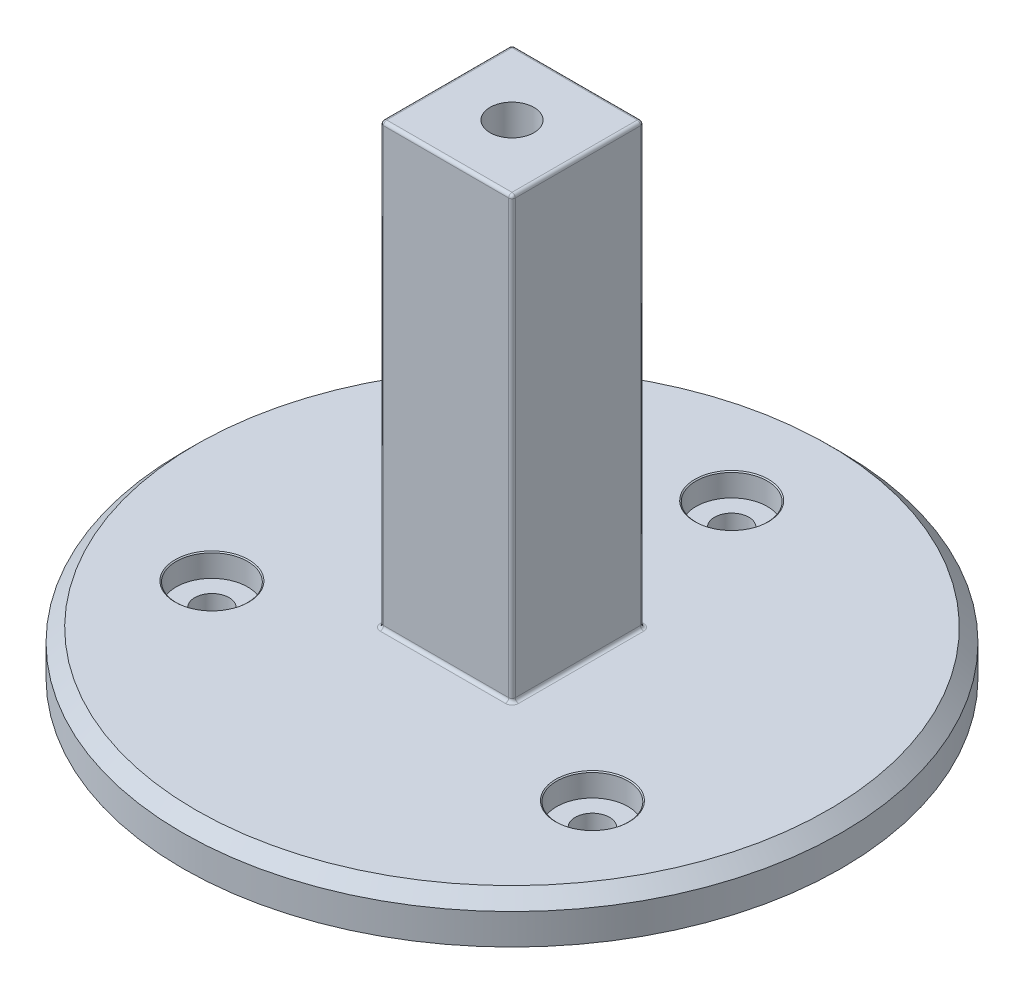
ISO-10303-21;
HEADER;
FILE_DESCRIPTION(('STEP AP214'),'2;1');
FILE_NAME('part.step','',(''),(''),'','','');
FILE_SCHEMA(('AUTOMOTIVE_DESIGN { 1 0 10303 214 1 1 1 1 }'));
ENDSEC;
DATA;
#1=APPLICATION_CONTEXT('core data for automotive mechanical design processes');
#2=APPLICATION_PROTOCOL_DEFINITION('international standard','automotive_design',2000,#1);
#3=PRODUCT_CONTEXT('',#1,'mechanical');
#4=PRODUCT('Part','Part','',(#3));
#5=PRODUCT_RELATED_PRODUCT_CATEGORY('part','',(#4));
#6=PRODUCT_DEFINITION_FORMATION('','',#4);
#7=PRODUCT_DEFINITION_CONTEXT('part definition',#1,'design');
#8=PRODUCT_DEFINITION('design','',#6,#7);
#9=PRODUCT_DEFINITION_SHAPE('','',#8);
#10=(LENGTH_UNIT() NAMED_UNIT(*) SI_UNIT(.MILLI.,.METRE.));
#11=(NAMED_UNIT(*) PLANE_ANGLE_UNIT() SI_UNIT($,.RADIAN.));
#12=(NAMED_UNIT(*) SI_UNIT($,.STERADIAN.) SOLID_ANGLE_UNIT());
#13=UNCERTAINTY_MEASURE_WITH_UNIT(LENGTH_MEASURE(1.E-05),#10,'distance_accuracy_value','');
#14=(GEOMETRIC_REPRESENTATION_CONTEXT(3) GLOBAL_UNCERTAINTY_ASSIGNED_CONTEXT((#13)) GLOBAL_UNIT_ASSIGNED_CONTEXT((#10,
#11,#12)) REPRESENTATION_CONTEXT('',''));
#15=CARTESIAN_POINT('',(0.,0.,0.));
#16=DIRECTION('',(0.,0.,1.));
#17=DIRECTION('',(1.,0.,0.));
#18=AXIS2_PLACEMENT_3D('',#15,#16,#17);
#19=CARTESIAN_POINT('',(0.,25.4,0.));
#20=DIRECTION('',(0.,1.,0.));
#21=DIRECTION('',(0.,0.,1.));
#22=AXIS2_PLACEMENT_3D('',#19,#20,#21);
#23=PLANE('',#22);
#24=CARTESIAN_POINT('',(0.,25.4,0.));
#25=DIRECTION('',(0.,1.,0.));
#26=DIRECTION('',(0.,0.,1.));
#27=AXIS2_PLACEMENT_3D('',#24,#25,#26);
#28=CIRCLE('',#27,182.88);
#29=CARTESIAN_POINT('',(0.,25.4,182.88));
#30=VERTEX_POINT('',#29);
#31=EDGE_CURVE('E340',#30,#30,#28,.T.);
#32=ORIENTED_EDGE('',*,*,#31,.T.);
#33=EDGE_LOOP('',(#32));
#34=FACE_BOUND('',#33,.T.);
#35=CARTESIAN_POINT('',(0.,25.4,-127.));
#36=DIRECTION('',(0.,1.,0.));
#37=DIRECTION('',(0.,0.,1.));
#38=AXIS2_PLACEMENT_3D('',#35,#36,#37);
#39=CIRCLE('',#38,21.2725);
#40=CARTESIAN_POINT('',(0.,25.4,-105.7275));
#41=VERTEX_POINT('',#40);
#42=EDGE_CURVE('E322',#41,#41,#39,.T.);
#43=ORIENTED_EDGE('',*,*,#42,.F.);
#44=EDGE_LOOP('',(#43));
#45=FACE_BOUND('',#44,.T.);
#46=CARTESIAN_POINT('',(-109.985226280623,25.4,63.5000000000005));
#47=DIRECTION('',(0.,1.,0.));
#48=DIRECTION('',(0.,0.,1.));
#49=AXIS2_PLACEMENT_3D('',#46,#47,#48);
#50=CIRCLE('',#49,21.2725);
#51=CARTESIAN_POINT('',(-109.985226280623,25.4,84.7725000000005));
#52=VERTEX_POINT('',#51);
#53=EDGE_CURVE('E307',#52,#52,#50,.T.);
#54=ORIENTED_EDGE('',*,*,#53,.F.);
#55=EDGE_LOOP('',(#54));
#56=FACE_BOUND('',#55,.T.);
#57=CARTESIAN_POINT('',(109.985226280624,25.4,63.499999999999));
#58=DIRECTION('',(0.,1.,0.));
#59=DIRECTION('',(0.,0.,1.));
#60=AXIS2_PLACEMENT_3D('',#57,#58,#59);
#61=CIRCLE('',#60,21.2725);
#62=CARTESIAN_POINT('',(109.985226280624,25.4,84.772499999999));
#63=VERTEX_POINT('',#62);
#64=EDGE_CURVE('E290',#63,#63,#61,.T.);
#65=ORIENTED_EDGE('',*,*,#64,.F.);
#66=EDGE_LOOP('',(#65));
#67=FACE_BOUND('',#66,.T.);
#68=CARTESIAN_POINT('',(-36.195,25.4,-36.195));
#69=DIRECTION('',(0.,1.,0.));
#70=DIRECTION('',(0.,0.,1.));
#71=AXIS2_PLACEMENT_3D('',#68,#69,#70);
#72=CIRCLE('',#71,3.81);
#73=CARTESIAN_POINT('',(-36.195,25.4,-40.005));
#74=VERTEX_POINT('',#73);
#75=CARTESIAN_POINT('',(-40.005,25.4,-36.195));
#76=VERTEX_POINT('',#75);
#77=EDGE_CURVE('E11',#74,#76,#72,.T.);
#78=ORIENTED_EDGE('',*,*,#77,.F.);
#79=DIRECTION('',(-1.,0.,0.));
#80=VECTOR('',#79,1.);
#81=CARTESIAN_POINT('',(0.,25.4,-40.005));
#82=LINE('',#81,#80);
#83=CARTESIAN_POINT('',(36.195,25.4,-40.005));
#84=VERTEX_POINT('',#83);
#85=EDGE_CURVE('E45',#74,#84,#82,.F.);
#86=ORIENTED_EDGE('',*,*,#85,.T.);
#87=CARTESIAN_POINT('',(36.195,25.4,-36.195));
#88=DIRECTION('',(0.,1.,0.));
#89=DIRECTION('',(0.,0.,1.));
#90=AXIS2_PLACEMENT_3D('',#87,#88,#89);
#91=CIRCLE('',#90,3.81);
#92=CARTESIAN_POINT('',(40.005,25.4,-36.195));
#93=VERTEX_POINT('',#92);
#94=EDGE_CURVE('E59',#93,#84,#91,.T.);
#95=ORIENTED_EDGE('',*,*,#94,.F.);
#96=DIRECTION('',(0.,0.,-1.));
#97=VECTOR('',#96,1.);
#98=CARTESIAN_POINT('',(40.005,25.4,0.));
#99=LINE('',#98,#97);
#100=CARTESIAN_POINT('',(40.005,25.4,36.195));
#101=VERTEX_POINT('',#100);
#102=EDGE_CURVE('E219',#93,#101,#99,.F.);
#103=ORIENTED_EDGE('',*,*,#102,.T.);
#104=CARTESIAN_POINT('',(36.195,25.4,36.195));
#105=DIRECTION('',(0.,1.,0.));
#106=DIRECTION('',(0.,0.,1.));
#107=AXIS2_PLACEMENT_3D('',#104,#105,#106);
#108=CIRCLE('',#107,3.81);
#109=CARTESIAN_POINT('',(36.195,25.4,40.005));
#110=VERTEX_POINT('',#109);
#111=EDGE_CURVE('E156',#110,#101,#108,.T.);
#112=ORIENTED_EDGE('',*,*,#111,.F.);
#113=DIRECTION('',(1.,0.,0.));
#114=VECTOR('',#113,1.);
#115=CARTESIAN_POINT('',(0.,25.4,40.005));
#116=LINE('',#115,#114);
#117=CARTESIAN_POINT('',(-36.195,25.4,40.005));
#118=VERTEX_POINT('',#117);
#119=EDGE_CURVE('E216',#110,#118,#116,.F.);
#120=ORIENTED_EDGE('',*,*,#119,.T.);
#121=CARTESIAN_POINT('',(-36.195,25.4,36.195));
#122=DIRECTION('',(0.,1.,0.));
#123=DIRECTION('',(0.,0.,1.));
#124=AXIS2_PLACEMENT_3D('',#121,#122,#123);
#125=CIRCLE('',#124,3.81);
#126=CARTESIAN_POINT('',(-40.005,25.4,36.195));
#127=VERTEX_POINT('',#126);
#128=EDGE_CURVE('E213',#127,#118,#125,.T.);
#129=ORIENTED_EDGE('',*,*,#128,.F.);
#130=DIRECTION('',(0.,0.,1.));
#131=VECTOR('',#130,1.);
#132=CARTESIAN_POINT('',(-40.005,25.4,0.));
#133=LINE('',#132,#131);
#134=EDGE_CURVE('E221',#127,#76,#133,.F.);
#135=ORIENTED_EDGE('',*,*,#134,.T.);
#136=EDGE_LOOP('',(#78,#86,#95,#103,#112,#120,#129,#135));
#137=FACE_BOUND('',#136,.T.);
#138=ADVANCED_FACE('F36',(#34,#45,#56,#67,#137),#23,.T.);
#139=CARTESIAN_POINT('',(0.,25.4,0.));
#140=DIRECTION('',(0.,-1.,0.));
#141=DIRECTION('',(0.,0.,-1.));
#142=AXIS2_PLACEMENT_3D('',#139,#140,#141);
#143=CYLINDRICAL_SURFACE('',#142,190.5);
#144=CARTESIAN_POINT('',(0.,17.7800000000001,0.));
#145=DIRECTION('',(0.,1.,0.));
#146=DIRECTION('',(0.,0.,1.));
#147=AXIS2_PLACEMENT_3D('',#144,#145,#146);
#148=CIRCLE('',#147,190.5);
#149=CARTESIAN_POINT('',(0.,17.7800000000001,190.5));
#150=VERTEX_POINT('',#149);
#151=EDGE_CURVE('E169',#150,#150,#148,.F.);
#152=ORIENTED_EDGE('',*,*,#151,.T.);
#153=EDGE_LOOP('',(#152));
#154=FACE_BOUND('',#153,.T.);
#155=CARTESIAN_POINT('',(0.,0.,0.));
#156=DIRECTION('',(0.,1.,0.));
#157=DIRECTION('',(0.,0.,1.));
#158=AXIS2_PLACEMENT_3D('',#155,#156,#157);
#159=CIRCLE('',#158,190.5);
#160=CARTESIAN_POINT('',(0.,0.,190.5));
#161=VERTEX_POINT('',#160);
#162=EDGE_CURVE('E337',#161,#161,#159,.T.);
#163=ORIENTED_EDGE('',*,*,#162,.T.);
#164=EDGE_LOOP('',(#163));
#165=FACE_BOUND('',#164,.T.);
#166=ADVANCED_FACE('F399',(#154,#165),#143,.T.);
#167=CARTESIAN_POINT('',(0.,0.,0.));
#168=DIRECTION('',(0.,1.,0.));
#169=DIRECTION('',(0.,0.,1.));
#170=AXIS2_PLACEMENT_3D('',#167,#168,#169);
#171=PLANE('',#170);
#172=CARTESIAN_POINT('',(109.985226280624,0.,63.499999999999));
#173=DIRECTION('',(0.,1.,0.));
#174=DIRECTION('',(0.,0.,1.));
#175=AXIS2_PLACEMENT_3D('',#172,#173,#174);
#176=CIRCLE('',#175,9.92124);
#177=CARTESIAN_POINT('',(109.985226280624,0.,73.421239999999));
#178=VERTEX_POINT('',#177);
#179=EDGE_CURVE('E304',#178,#178,#176,.T.);
#180=ORIENTED_EDGE('',*,*,#179,.T.);
#181=EDGE_LOOP('',(#180));
#182=FACE_BOUND('',#181,.T.);
#183=CARTESIAN_POINT('',(-109.985226280623,0.,63.5000000000005));
#184=DIRECTION('',(0.,1.,0.));
#185=DIRECTION('',(0.,0.,1.));
#186=AXIS2_PLACEMENT_3D('',#183,#184,#185);
#187=CIRCLE('',#186,9.92124);
#188=CARTESIAN_POINT('',(-109.985226280623,0.,73.4212400000005));
#189=VERTEX_POINT('',#188);
#190=EDGE_CURVE('E319',#189,#189,#187,.T.);
#191=ORIENTED_EDGE('',*,*,#190,.T.);
#192=EDGE_LOOP('',(#191));
#193=FACE_BOUND('',#192,.T.);
#194=CARTESIAN_POINT('',(0.,0.,-127.));
#195=DIRECTION('',(0.,1.,0.));
#196=DIRECTION('',(0.,0.,1.));
#197=AXIS2_PLACEMENT_3D('',#194,#195,#196);
#198=CIRCLE('',#197,9.92124);
#199=CARTESIAN_POINT('',(0.,0.,-117.07876));
#200=VERTEX_POINT('',#199);
#201=EDGE_CURVE('E334',#200,#200,#198,.T.);
#202=ORIENTED_EDGE('',*,*,#201,.T.);
#203=EDGE_LOOP('',(#202));
#204=FACE_BOUND('',#203,.T.);
#205=ORIENTED_EDGE('',*,*,#162,.F.);
#206=EDGE_LOOP('',(#205));
#207=FACE_BOUND('',#206,.T.);
#208=ADVANCED_FACE('F405',(#182,#193,#204,#207),#171,.F.);
#209=CARTESIAN_POINT('',(0.,25.4,0.));
#210=DIRECTION('',(0.,-1.,0.));
#211=DIRECTION('',(0.,0.,-1.));
#212=AXIS2_PLACEMENT_3D('',#209,#210,#211);
#213=CONICAL_SURFACE('',#212,182.88,0.785398163397454);
#214=ORIENTED_EDGE('',*,*,#151,.F.);
#215=EDGE_LOOP('',(#214));
#216=FACE_BOUND('',#215,.T.);
#217=ORIENTED_EDGE('',*,*,#31,.F.);
#218=EDGE_LOOP('',(#217));
#219=FACE_BOUND('',#218,.T.);
#220=ADVANCED_FACE('F413',(#216,#219),#213,.T.);
#221=CARTESIAN_POINT('',(38.1,279.4,38.1));
#222=DIRECTION('',(-1.,0.,0.));
#223=DIRECTION('',(0.,0.,1.));
#224=AXIS2_PLACEMENT_3D('',#221,#222,#223);
#225=PLANE('',#224);
#226=DIRECTION('',(0.,0.,-1.));
#227=VECTOR('',#226,1.);
#228=CARTESIAN_POINT('',(38.1,277.495,38.1));
#229=LINE('',#228,#227);
#230=CARTESIAN_POINT('',(38.1,277.495,-36.195));
#231=VERTEX_POINT('',#230);
#232=CARTESIAN_POINT('',(38.1,277.495,36.195));
#233=VERTEX_POINT('',#232);
#234=EDGE_CURVE('E173',#231,#233,#229,.F.);
#235=ORIENTED_EDGE('',*,*,#234,.T.);
#236=DIRECTION('',(0.,-1.,0.));
#237=VECTOR('',#236,1.);
#238=CARTESIAN_POINT('',(38.1,279.4,36.195));
#239=LINE('',#238,#237);
#240=CARTESIAN_POINT('',(38.1,27.305,36.195));
#241=VERTEX_POINT('',#240);
#242=EDGE_CURVE('E144',#233,#241,#239,.T.);
#243=ORIENTED_EDGE('',*,*,#242,.T.);
#244=DIRECTION('',(0.,0.,-1.));
#245=VECTOR('',#244,1.);
#246=CARTESIAN_POINT('',(38.1,27.305,38.1));
#247=LINE('',#246,#245);
#248=CARTESIAN_POINT('',(38.1,27.305,-36.195));
#249=VERTEX_POINT('',#248);
#250=EDGE_CURVE('E163',#241,#249,#247,.T.);
#251=ORIENTED_EDGE('',*,*,#250,.T.);
#252=DIRECTION('',(0.,-1.,0.));
#253=VECTOR('',#252,1.);
#254=CARTESIAN_POINT('',(38.1,279.4,-36.195));
#255=LINE('',#254,#253);
#256=EDGE_CURVE('E168',#249,#231,#255,.F.);
#257=ORIENTED_EDGE('',*,*,#256,.T.);
#258=EDGE_LOOP('',(#235,#243,#251,#257));
#259=FACE_BOUND('',#258,.T.);
#260=ADVANCED_FACE('F171',(#259),#225,.F.);
#261=CARTESIAN_POINT('',(-38.1,279.4,-38.1));
#262=DIRECTION('',(0.,0.,1.));
#263=DIRECTION('',(1.,0.,0.));
#264=AXIS2_PLACEMENT_3D('',#261,#262,#263);
#265=PLANE('',#264);
#266=DIRECTION('',(0.,-1.,0.));
#267=VECTOR('',#266,1.);
#268=CARTESIAN_POINT('',(-36.195,279.4,-38.1));
#269=LINE('',#268,#267);
#270=CARTESIAN_POINT('',(-36.195,27.305,-38.1));
#271=VERTEX_POINT('',#270);
#272=CARTESIAN_POINT('',(-36.195,277.495,-38.1));
#273=VERTEX_POINT('',#272);
#274=EDGE_CURVE('E206',#271,#273,#269,.F.);
#275=ORIENTED_EDGE('',*,*,#274,.T.);
#276=DIRECTION('',(-1.,0.,0.));
#277=VECTOR('',#276,1.);
#278=CARTESIAN_POINT('',(-38.1,277.495,-38.1));
#279=LINE('',#278,#277);
#280=CARTESIAN_POINT('',(36.195,277.495,-38.1));
#281=VERTEX_POINT('',#280);
#282=EDGE_CURVE('E210',#273,#281,#279,.F.);
#283=ORIENTED_EDGE('',*,*,#282,.T.);
#284=DIRECTION('',(0.,-1.,0.));
#285=VECTOR('',#284,1.);
#286=CARTESIAN_POINT('',(36.195,279.4,-38.1));
#287=LINE('',#286,#285);
#288=CARTESIAN_POINT('',(36.195,27.305,-38.1));
#289=VERTEX_POINT('',#288);
#290=EDGE_CURVE('E208',#281,#289,#287,.T.);
#291=ORIENTED_EDGE('',*,*,#290,.T.);
#292=DIRECTION('',(-1.,0.,0.));
#293=VECTOR('',#292,1.);
#294=CARTESIAN_POINT('',(-38.1,27.305,-38.1));
#295=LINE('',#294,#293);
#296=EDGE_CURVE('E204',#289,#271,#295,.T.);
#297=ORIENTED_EDGE('',*,*,#296,.T.);
#298=EDGE_LOOP('',(#275,#283,#291,#297));
#299=FACE_BOUND('',#298,.T.);
#300=ADVANCED_FACE('F722',(#299),#265,.F.);
#301=CARTESIAN_POINT('',(-38.1,279.4,38.1));
#302=DIRECTION('',(1.,0.,0.));
#303=DIRECTION('',(0.,0.,-1.));
#304=AXIS2_PLACEMENT_3D('',#301,#302,#303);
#305=PLANE('',#304);
#306=DIRECTION('',(0.,0.,1.));
#307=VECTOR('',#306,1.);
#308=CARTESIAN_POINT('',(-38.1,27.305,38.1));
#309=LINE('',#308,#307);
#310=CARTESIAN_POINT('',(-38.1,27.305,-36.195));
#311=VERTEX_POINT('',#310);
#312=CARTESIAN_POINT('',(-38.1,27.305,36.195));
#313=VERTEX_POINT('',#312);
#314=EDGE_CURVE('E186',#311,#313,#309,.T.);
#315=ORIENTED_EDGE('',*,*,#314,.T.);
#316=DIRECTION('',(0.,-1.,0.));
#317=VECTOR('',#316,1.);
#318=CARTESIAN_POINT('',(-38.1,279.4,36.195));
#319=LINE('',#318,#317);
#320=CARTESIAN_POINT('',(-38.1,277.495,36.195));
#321=VERTEX_POINT('',#320);
#322=EDGE_CURVE('E192',#313,#321,#319,.F.);
#323=ORIENTED_EDGE('',*,*,#322,.T.);
#324=DIRECTION('',(0.,0.,1.));
#325=VECTOR('',#324,1.);
#326=CARTESIAN_POINT('',(-38.1,277.495,38.1));
#327=LINE('',#326,#325);
#328=CARTESIAN_POINT('',(-38.1,277.495,-36.195));
#329=VERTEX_POINT('',#328);
#330=EDGE_CURVE('E190',#321,#329,#327,.F.);
#331=ORIENTED_EDGE('',*,*,#330,.T.);
#332=DIRECTION('',(0.,-1.,0.));
#333=VECTOR('',#332,1.);
#334=CARTESIAN_POINT('',(-38.1,279.4,-36.195));
#335=LINE('',#334,#333);
#336=EDGE_CURVE('E188',#329,#311,#335,.T.);
#337=ORIENTED_EDGE('',*,*,#336,.T.);
#338=EDGE_LOOP('',(#315,#323,#331,#337));
#339=FACE_BOUND('',#338,.T.);
#340=ADVANCED_FACE('F714',(#339),#305,.F.);
#341=CARTESIAN_POINT('',(-38.1,279.4,38.1));
#342=DIRECTION('',(0.,0.,-1.));
#343=DIRECTION('',(-1.,0.,0.));
#344=AXIS2_PLACEMENT_3D('',#341,#342,#343);
#345=PLANE('',#344);
#346=DIRECTION('',(0.,-1.,0.));
#347=VECTOR('',#346,1.);
#348=CARTESIAN_POINT('',(36.195,279.4,38.1));
#349=LINE('',#348,#347);
#350=CARTESIAN_POINT('',(36.195,27.305,38.1));
#351=VERTEX_POINT('',#350);
#352=CARTESIAN_POINT('',(36.195,277.495,38.1));
#353=VERTEX_POINT('',#352);
#354=EDGE_CURVE('E146',#351,#353,#349,.F.);
#355=ORIENTED_EDGE('',*,*,#354,.T.);
#356=DIRECTION('',(1.,0.,0.));
#357=VECTOR('',#356,1.);
#358=CARTESIAN_POINT('',(-38.1,277.495,38.1));
#359=LINE('',#358,#357);
#360=CARTESIAN_POINT('',(-36.195,277.495,38.1));
#361=VERTEX_POINT('',#360);
#362=EDGE_CURVE('E184',#353,#361,#359,.F.);
#363=ORIENTED_EDGE('',*,*,#362,.T.);
#364=DIRECTION('',(0.,-1.,0.));
#365=VECTOR('',#364,1.);
#366=CARTESIAN_POINT('',(-36.195,279.4,38.1));
#367=LINE('',#366,#365);
#368=CARTESIAN_POINT('',(-36.195,27.305,38.1));
#369=VERTEX_POINT('',#368);
#370=EDGE_CURVE('E177',#361,#369,#367,.T.);
#371=ORIENTED_EDGE('',*,*,#370,.T.);
#372=DIRECTION('',(1.,0.,0.));
#373=VECTOR('',#372,1.);
#374=CARTESIAN_POINT('',(-38.1,27.305,38.1));
#375=LINE('',#374,#373);
#376=EDGE_CURVE('E175',#369,#351,#375,.T.);
#377=ORIENTED_EDGE('',*,*,#376,.T.);
#378=EDGE_LOOP('',(#355,#363,#371,#377));
#379=FACE_BOUND('',#378,.T.);
#380=ADVANCED_FACE('F368',(#379),#345,.F.);
#381=CARTESIAN_POINT('',(0.,279.4,0.));
#382=DIRECTION('',(0.,-1.,0.));
#383=DIRECTION('',(0.,0.,-1.));
#384=AXIS2_PLACEMENT_3D('',#381,#382,#383);
#385=PLANE('',#384);
#386=DIRECTION('',(1.,0.,0.));
#387=VECTOR('',#386,1.);
#388=CARTESIAN_POINT('',(0.,279.4,36.195));
#389=LINE('',#388,#387);
#390=CARTESIAN_POINT('',(-36.195,279.4,36.195));
#391=VERTEX_POINT('',#390);
#392=CARTESIAN_POINT('',(36.195,279.4,36.195));
#393=VERTEX_POINT('',#392);
#394=EDGE_CURVE('E199',#391,#393,#389,.T.);
#395=ORIENTED_EDGE('',*,*,#394,.T.);
#396=DIRECTION('',(0.,0.,-1.));
#397=VECTOR('',#396,1.);
#398=CARTESIAN_POINT('',(36.195,279.4,0.));
#399=LINE('',#398,#397);
#400=CARTESIAN_POINT('',(36.195,279.4,-36.195));
#401=VERTEX_POINT('',#400);
#402=EDGE_CURVE('E201',#393,#401,#399,.T.);
#403=ORIENTED_EDGE('',*,*,#402,.T.);
#404=DIRECTION('',(-1.,0.,0.));
#405=VECTOR('',#404,1.);
#406=CARTESIAN_POINT('',(0.,279.4,-36.195));
#407=LINE('',#406,#405);
#408=CARTESIAN_POINT('',(-36.195,279.4,-36.195));
#409=VERTEX_POINT('',#408);
#410=EDGE_CURVE('E195',#401,#409,#407,.T.);
#411=ORIENTED_EDGE('',*,*,#410,.T.);
#412=DIRECTION('',(0.,0.,1.));
#413=VECTOR('',#412,1.);
#414=CARTESIAN_POINT('',(-36.195,279.4,0.));
#415=LINE('',#414,#413);
#416=EDGE_CURVE('E197',#409,#391,#415,.T.);
#417=ORIENTED_EDGE('',*,*,#416,.T.);
#418=EDGE_LOOP('',(#395,#403,#411,#417));
#419=FACE_BOUND('',#418,.T.);
#420=CARTESIAN_POINT('',(0.,279.4,0.));
#421=DIRECTION('',(0.,1.,0.));
#422=DIRECTION('',(0.,0.,1.));
#423=AXIS2_PLACEMENT_3D('',#420,#421,#422);
#424=CIRCLE('',#423,12.7);
#425=CARTESIAN_POINT('',(0.,279.4,12.7));
#426=VERTEX_POINT('',#425);
#427=EDGE_CURVE('E279',#426,#426,#424,.T.);
#428=ORIENTED_EDGE('',*,*,#427,.F.);
#429=EDGE_LOOP('',(#428));
#430=FACE_BOUND('',#429,.T.);
#431=ADVANCED_FACE('F697',(#419,#430),#385,.F.);
#432=CARTESIAN_POINT('',(0.,25.4,-127.));
#433=DIRECTION('',(0.,1.,0.));
#434=DIRECTION('',(0.,0.,1.));
#435=AXIS2_PLACEMENT_3D('',#432,#433,#434);
#436=CYLINDRICAL_SURFACE('',#435,9.92124);
#437=ORIENTED_EDGE('',*,*,#201,.F.);
#438=EDGE_LOOP('',(#437));
#439=FACE_BOUND('',#438,.T.);
#440=CARTESIAN_POINT('',(0.,12.0904,-127.));
#441=DIRECTION('',(0.,1.,0.));
#442=DIRECTION('',(0.,0.,1.));
#443=AXIS2_PLACEMENT_3D('',#440,#441,#442);
#444=CIRCLE('',#443,9.92124);
#445=CARTESIAN_POINT('',(0.,12.0904,-117.07876));
#446=VERTEX_POINT('',#445);
#447=EDGE_CURVE('E331',#446,#446,#444,.T.);
#448=ORIENTED_EDGE('',*,*,#447,.T.);
#449=EDGE_LOOP('',(#448));
#450=FACE_BOUND('',#449,.T.);
#451=ADVANCED_FACE('F688',(#439,#450),#436,.F.);
#452=CARTESIAN_POINT('',(20.6375,12.0904,-127.));
#453=DIRECTION('',(0.,-1.,0.));
#454=DIRECTION('',(0.,0.,-1.));
#455=AXIS2_PLACEMENT_3D('',#452,#453,#454);
#456=PLANE('',#455);
#457=ORIENTED_EDGE('',*,*,#447,.F.);
#458=EDGE_LOOP('',(#457));
#459=FACE_BOUND('',#458,.T.);
#460=CARTESIAN_POINT('',(0.,12.0904,-127.));
#461=DIRECTION('',(0.,1.,0.));
#462=DIRECTION('',(0.,0.,1.));
#463=AXIS2_PLACEMENT_3D('',#460,#461,#462);
#464=CIRCLE('',#463,20.6375);
#465=CARTESIAN_POINT('',(0.,12.0904,-106.3625));
#466=VERTEX_POINT('',#465);
#467=EDGE_CURVE('E328',#466,#466,#464,.T.);
#468=ORIENTED_EDGE('',*,*,#467,.T.);
#469=EDGE_LOOP('',(#468));
#470=FACE_BOUND('',#469,.T.);
#471=ADVANCED_FACE('F679',(#459,#470),#456,.F.);
#472=CARTESIAN_POINT('',(0.,25.4,-127.));
#473=DIRECTION('',(0.,1.,0.));
#474=DIRECTION('',(0.,0.,1.));
#475=AXIS2_PLACEMENT_3D('',#472,#473,#474);
#476=CYLINDRICAL_SURFACE('',#475,20.6375);
#477=ORIENTED_EDGE('',*,*,#467,.F.);
#478=EDGE_LOOP('',(#477));
#479=FACE_BOUND('',#478,.T.);
#480=CARTESIAN_POINT('',(0.,24.8671717342024,-127.));
#481=DIRECTION('',(0.,1.,0.));
#482=DIRECTION('',(0.,0.,1.));
#483=AXIS2_PLACEMENT_3D('',#480,#481,#482);
#484=CIRCLE('',#483,20.6375);
#485=CARTESIAN_POINT('',(0.,24.8671717342024,-106.3625));
#486=VERTEX_POINT('',#485);
#487=EDGE_CURVE('E325',#486,#486,#484,.T.);
#488=ORIENTED_EDGE('',*,*,#487,.T.);
#489=EDGE_LOOP('',(#488));
#490=FACE_BOUND('',#489,.T.);
#491=ADVANCED_FACE('F670',(#479,#490),#476,.F.);
#492=CARTESIAN_POINT('',(0.,25.4,-127.));
#493=DIRECTION('',(0.,1.,0.));
#494=DIRECTION('',(0.,0.,1.));
#495=AXIS2_PLACEMENT_3D('',#492,#493,#494);
#496=CONICAL_SURFACE('',#495,21.2725,0.872664625997164);
#497=ORIENTED_EDGE('',*,*,#487,.F.);
#498=EDGE_LOOP('',(#497));
#499=FACE_BOUND('',#498,.T.);
#500=ORIENTED_EDGE('',*,*,#42,.T.);
#501=EDGE_LOOP('',(#500));
#502=FACE_BOUND('',#501,.T.);
#503=ADVANCED_FACE('F660',(#499,#502),#496,.F.);
#504=CARTESIAN_POINT('',(-109.985226280623,25.4,63.5000000000005));
#505=DIRECTION('',(0.,1.,0.));
#506=DIRECTION('',(0.,0.,1.));
#507=AXIS2_PLACEMENT_3D('',#504,#505,#506);
#508=CYLINDRICAL_SURFACE('',#507,9.92124);
#509=ORIENTED_EDGE('',*,*,#190,.F.);
#510=EDGE_LOOP('',(#509));
#511=FACE_BOUND('',#510,.T.);
#512=CARTESIAN_POINT('',(-109.985226280623,12.0904,63.5000000000005));
#513=DIRECTION('',(0.,1.,0.));
#514=DIRECTION('',(0.,0.,1.));
#515=AXIS2_PLACEMENT_3D('',#512,#513,#514);
#516=CIRCLE('',#515,9.92124);
#517=CARTESIAN_POINT('',(-109.985226280623,12.0904,73.4212400000005));
#518=VERTEX_POINT('',#517);
#519=EDGE_CURVE('E316',#518,#518,#516,.T.);
#520=ORIENTED_EDGE('',*,*,#519,.T.);
#521=EDGE_LOOP('',(#520));
#522=FACE_BOUND('',#521,.T.);
#523=ADVANCED_FACE('F651',(#511,#522),#508,.F.);
#524=CARTESIAN_POINT('',(-89.3477262806234,12.0904,63.5000000000005));
#525=DIRECTION('',(0.,-1.,0.));
#526=DIRECTION('',(0.,0.,-1.));
#527=AXIS2_PLACEMENT_3D('',#524,#525,#526);
#528=PLANE('',#527);
#529=ORIENTED_EDGE('',*,*,#519,.F.);
#530=EDGE_LOOP('',(#529));
#531=FACE_BOUND('',#530,.T.);
#532=CARTESIAN_POINT('',(-109.985226280623,12.0904,63.5000000000005));
#533=DIRECTION('',(0.,1.,0.));
#534=DIRECTION('',(0.,0.,1.));
#535=AXIS2_PLACEMENT_3D('',#532,#533,#534);
#536=CIRCLE('',#535,20.6375);
#537=CARTESIAN_POINT('',(-109.985226280623,12.0904,84.1375000000005));
#538=VERTEX_POINT('',#537);
#539=EDGE_CURVE('E313',#538,#538,#536,.T.);
#540=ORIENTED_EDGE('',*,*,#539,.T.);
#541=EDGE_LOOP('',(#540));
#542=FACE_BOUND('',#541,.T.);
#543=ADVANCED_FACE('F642',(#531,#542),#528,.F.);
#544=CARTESIAN_POINT('',(-109.985226280623,25.4,63.5000000000005));
#545=DIRECTION('',(0.,1.,0.));
#546=DIRECTION('',(0.,0.,1.));
#547=AXIS2_PLACEMENT_3D('',#544,#545,#546);
#548=CYLINDRICAL_SURFACE('',#547,20.6375);
#549=ORIENTED_EDGE('',*,*,#539,.F.);
#550=EDGE_LOOP('',(#549));
#551=FACE_BOUND('',#550,.T.);
#552=CARTESIAN_POINT('',(-109.985226280623,24.8671717342024,63.5000000000005));
#553=DIRECTION('',(0.,1.,0.));
#554=DIRECTION('',(0.,0.,1.));
#555=AXIS2_PLACEMENT_3D('',#552,#553,#554);
#556=CIRCLE('',#555,20.6375);
#557=CARTESIAN_POINT('',(-109.985226280623,24.8671717342024,84.1375000000005));
#558=VERTEX_POINT('',#557);
#559=EDGE_CURVE('E310',#558,#558,#556,.T.);
#560=ORIENTED_EDGE('',*,*,#559,.T.);
#561=EDGE_LOOP('',(#560));
#562=FACE_BOUND('',#561,.T.);
#563=ADVANCED_FACE('F633',(#551,#562),#548,.F.);
#564=CARTESIAN_POINT('',(-109.985226280623,25.4,63.5000000000005));
#565=DIRECTION('',(0.,1.,0.));
#566=DIRECTION('',(0.,0.,1.));
#567=AXIS2_PLACEMENT_3D('',#564,#565,#566);
#568=CONICAL_SURFACE('',#567,21.2725,0.872664625997164);
#569=ORIENTED_EDGE('',*,*,#559,.F.);
#570=EDGE_LOOP('',(#569));
#571=FACE_BOUND('',#570,.T.);
#572=ORIENTED_EDGE('',*,*,#53,.T.);
#573=EDGE_LOOP('',(#572));
#574=FACE_BOUND('',#573,.T.);
#575=ADVANCED_FACE('F624',(#571,#574),#568,.F.);
#576=CARTESIAN_POINT('',(109.985226280624,25.4,63.499999999999));
#577=DIRECTION('',(0.,1.,0.));
#578=DIRECTION('',(0.,0.,1.));
#579=AXIS2_PLACEMENT_3D('',#576,#577,#578);
#580=CYLINDRICAL_SURFACE('',#579,9.92124);
#581=ORIENTED_EDGE('',*,*,#179,.F.);
#582=EDGE_LOOP('',(#581));
#583=FACE_BOUND('',#582,.T.);
#584=CARTESIAN_POINT('',(109.985226280624,12.0904,63.499999999999));
#585=DIRECTION('',(0.,1.,0.));
#586=DIRECTION('',(0.,0.,1.));
#587=AXIS2_PLACEMENT_3D('',#584,#585,#586);
#588=CIRCLE('',#587,9.92124);
#589=CARTESIAN_POINT('',(109.985226280624,12.0904,73.421239999999));
#590=VERTEX_POINT('',#589);
#591=EDGE_CURVE('E301',#590,#590,#588,.T.);
#592=ORIENTED_EDGE('',*,*,#591,.T.);
#593=EDGE_LOOP('',(#592));
#594=FACE_BOUND('',#593,.T.);
#595=ADVANCED_FACE('F615',(#583,#594),#580,.F.);
#596=CARTESIAN_POINT('',(130.622726280624,12.0904,63.499999999999));
#597=DIRECTION('',(0.,-1.,0.));
#598=DIRECTION('',(0.,0.,-1.));
#599=AXIS2_PLACEMENT_3D('',#596,#597,#598);
#600=PLANE('',#599);
#601=ORIENTED_EDGE('',*,*,#591,.F.);
#602=EDGE_LOOP('',(#601));
#603=FACE_BOUND('',#602,.T.);
#604=CARTESIAN_POINT('',(109.985226280624,12.0904,63.499999999999));
#605=DIRECTION('',(0.,1.,0.));
#606=DIRECTION('',(0.,0.,1.));
#607=AXIS2_PLACEMENT_3D('',#604,#605,#606);
#608=CIRCLE('',#607,20.6375);
#609=CARTESIAN_POINT('',(109.985226280624,12.0904,84.137499999999));
#610=VERTEX_POINT('',#609);
#611=EDGE_CURVE('E298',#610,#610,#608,.T.);
#612=ORIENTED_EDGE('',*,*,#611,.T.);
#613=EDGE_LOOP('',(#612));
#614=FACE_BOUND('',#613,.T.);
#615=ADVANCED_FACE('F606',(#603,#614),#600,.F.);
#616=CARTESIAN_POINT('',(109.985226280624,25.4,63.499999999999));
#617=DIRECTION('',(0.,1.,0.));
#618=DIRECTION('',(0.,0.,1.));
#619=AXIS2_PLACEMENT_3D('',#616,#617,#618);
#620=CYLINDRICAL_SURFACE('',#619,20.6375);
#621=ORIENTED_EDGE('',*,*,#611,.F.);
#622=EDGE_LOOP('',(#621));
#623=FACE_BOUND('',#622,.T.);
#624=CARTESIAN_POINT('',(109.985226280624,24.8671717342024,63.499999999999));
#625=DIRECTION('',(0.,1.,0.));
#626=DIRECTION('',(0.,0.,1.));
#627=AXIS2_PLACEMENT_3D('',#624,#625,#626);
#628=CIRCLE('',#627,20.6375);
#629=CARTESIAN_POINT('',(109.985226280624,24.8671717342024,84.137499999999));
#630=VERTEX_POINT('',#629);
#631=EDGE_CURVE('E295',#630,#630,#628,.T.);
#632=ORIENTED_EDGE('',*,*,#631,.T.);
#633=EDGE_LOOP('',(#632));
#634=FACE_BOUND('',#633,.T.);
#635=ADVANCED_FACE('F597',(#623,#634),#620,.F.);
#636=CARTESIAN_POINT('',(109.985226280624,25.4,63.499999999999));
#637=DIRECTION('',(0.,1.,0.));
#638=DIRECTION('',(0.,0.,1.));
#639=AXIS2_PLACEMENT_3D('',#636,#637,#638);
#640=CONICAL_SURFACE('',#639,21.2725,0.872664625997164);
#641=ORIENTED_EDGE('',*,*,#631,.F.);
#642=EDGE_LOOP('',(#641));
#643=FACE_BOUND('',#642,.T.);
#644=ORIENTED_EDGE('',*,*,#64,.T.);
#645=EDGE_LOOP('',(#644));
#646=FACE_BOUND('',#645,.T.);
#647=ADVANCED_FACE('F588',(#643,#646),#640,.F.);
#648=CARTESIAN_POINT('',(0.,25.4,0.));
#649=DIRECTION('',(0.,-1.,0.));
#650=DIRECTION('',(0.,0.,-1.));
#651=AXIS2_PLACEMENT_3D('',#648,#649,#650);
#652=PLANE('',#651);
#653=CARTESIAN_POINT('',(0.,25.4,0.));
#654=DIRECTION('',(0.,1.,0.));
#655=DIRECTION('',(0.,0.,1.));
#656=AXIS2_PLACEMENT_3D('',#653,#654,#655);
#657=CIRCLE('',#656,12.7);
#658=CARTESIAN_POINT('',(0.,25.4,12.7));
#659=VERTEX_POINT('',#658);
#660=EDGE_CURVE('E285',#659,#659,#657,.T.);
#661=ORIENTED_EDGE('',*,*,#660,.T.);
#662=EDGE_LOOP('',(#661));
#663=FACE_BOUND('',#662,.T.);
#664=ADVANCED_FACE('F579',(#663),#652,.F.);
#665=CARTESIAN_POINT('',(0.,279.4,0.));
#666=DIRECTION('',(0.,1.,0.));
#667=DIRECTION('',(0.,0.,1.));
#668=AXIS2_PLACEMENT_3D('',#665,#666,#667);
#669=CYLINDRICAL_SURFACE('',#668,12.7);
#670=ORIENTED_EDGE('',*,*,#660,.F.);
#671=EDGE_LOOP('',(#670));
#672=FACE_BOUND('',#671,.T.);
#673=ORIENTED_EDGE('',*,*,#427,.T.);
#674=EDGE_LOOP('',(#673));
#675=FACE_BOUND('',#674,.T.);
#676=ADVANCED_FACE('F565',(#672,#675),#669,.F.);
#677=CARTESIAN_POINT('',(-36.195,279.4,-36.195));
#678=DIRECTION('',(0.,-1.,0.));
#679=DIRECTION('',(0.,0.,-1.));
#680=AXIS2_PLACEMENT_3D('',#677,#678,#679);
#681=CYLINDRICAL_SURFACE('',#680,1.905);
#682=CARTESIAN_POINT('',(-36.195,277.495,-36.195));
#683=DIRECTION('',(0.,1.,0.));
#684=DIRECTION('',(0.,0.,1.));
#685=AXIS2_PLACEMENT_3D('',#682,#683,#684);
#686=CIRCLE('',#685,1.905);
#687=EDGE_CURVE('E40',#273,#329,#686,.T.);
#688=ORIENTED_EDGE('',*,*,#687,.F.);
#689=ORIENTED_EDGE('',*,*,#274,.F.);
#690=CARTESIAN_POINT('',(-36.195,27.305,-36.195));
#691=DIRECTION('',(0.,1.,0.));
#692=DIRECTION('',(0.,0.,1.));
#693=AXIS2_PLACEMENT_3D('',#690,#691,#692);
#694=CIRCLE('',#693,1.905);
#695=EDGE_CURVE('E273',#311,#271,#694,.F.);
#696=ORIENTED_EDGE('',*,*,#695,.F.);
#697=ORIENTED_EDGE('',*,*,#336,.F.);
#698=EDGE_LOOP('',(#688,#689,#696,#697));
#699=FACE_BOUND('',#698,.T.);
#700=ADVANCED_FACE('F38',(#699),#681,.T.);
#701=CARTESIAN_POINT('',(-36.195,277.495,-36.195));
#702=DIRECTION('',(0.,0.,1.));
#703=DIRECTION('',(1.,0.,0.));
#704=AXIS2_PLACEMENT_3D('',#701,#702,#703);
#705=SPHERICAL_SURFACE('',#704,1.905);
#706=CARTESIAN_POINT('',(-36.195,277.495,-36.195));
#707=DIRECTION('',(-1.,0.,0.));
#708=DIRECTION('',(0.,0.,1.));
#709=AXIS2_PLACEMENT_3D('',#706,#707,#708);
#710=CIRCLE('',#709,1.905);
#711=EDGE_CURVE('E268',#273,#409,#710,.F.);
#712=ORIENTED_EDGE('',*,*,#711,.F.);
#713=ORIENTED_EDGE('',*,*,#687,.T.);
#714=CARTESIAN_POINT('',(-36.195,277.495,-36.195));
#715=DIRECTION('',(0.,0.,-1.));
#716=DIRECTION('',(0.,1.,0.));
#717=AXIS2_PLACEMENT_3D('',#714,#715,#716);
#718=CIRCLE('',#717,1.905);
#719=EDGE_CURVE('E271',#409,#329,#718,.F.);
#720=ORIENTED_EDGE('',*,*,#719,.F.);
#721=EDGE_LOOP('',(#712,#713,#720));
#722=FACE_BOUND('',#721,.T.);
#723=ADVANCED_FACE('F551',(#722),#705,.T.);
#724=CARTESIAN_POINT('',(-36.195,27.305,-36.195));
#725=DIRECTION('',(0.,1.,0.));
#726=DIRECTION('',(0.,0.,1.));
#727=AXIS2_PLACEMENT_3D('',#724,#725,#726);
#728=TOROIDAL_SURFACE('',#727,3.81,1.905);
#729=CARTESIAN_POINT('',(-40.005,27.305,-36.195));
#730=DIRECTION('',(0.,0.,1.));
#731=DIRECTION('',(1.,0.,0.));
#732=AXIS2_PLACEMENT_3D('',#729,#730,#731);
#733=CIRCLE('',#732,1.905);
#734=EDGE_CURVE('E262',#311,#76,#733,.F.);
#735=ORIENTED_EDGE('',*,*,#734,.F.);
#736=ORIENTED_EDGE('',*,*,#695,.T.);
#737=CARTESIAN_POINT('',(-36.195,27.305,-40.005));
#738=DIRECTION('',(1.,0.,0.));
#739=DIRECTION('',(0.,0.,-1.));
#740=AXIS2_PLACEMENT_3D('',#737,#738,#739);
#741=CIRCLE('',#740,1.905);
#742=EDGE_CURVE('E265',#74,#271,#741,.F.);
#743=ORIENTED_EDGE('',*,*,#742,.F.);
#744=ORIENTED_EDGE('',*,*,#77,.T.);
#745=EDGE_LOOP('',(#735,#736,#743,#744));
#746=FACE_BOUND('',#745,.T.);
#747=ADVANCED_FACE('F383',(#746),#728,.F.);
#748=CARTESIAN_POINT('',(-36.195,277.495,0.));
#749=DIRECTION('',(0.,0.,1.));
#750=DIRECTION('',(1.,0.,0.));
#751=AXIS2_PLACEMENT_3D('',#748,#749,#750);
#752=CYLINDRICAL_SURFACE('',#751,1.905);
#753=ORIENTED_EDGE('',*,*,#719,.T.);
#754=ORIENTED_EDGE('',*,*,#330,.F.);
#755=CARTESIAN_POINT('',(-36.195,277.495,36.195));
#756=DIRECTION('',(0.,0.,1.));
#757=DIRECTION('',(1.,0.,0.));
#758=AXIS2_PLACEMENT_3D('',#755,#756,#757);
#759=CIRCLE('',#758,1.905);
#760=EDGE_CURVE('E257',#391,#321,#759,.T.);
#761=ORIENTED_EDGE('',*,*,#760,.F.);
#762=ORIENTED_EDGE('',*,*,#416,.F.);
#763=EDGE_LOOP('',(#753,#754,#761,#762));
#764=FACE_BOUND('',#763,.T.);
#765=ADVANCED_FACE('F534',(#764),#752,.T.);
#766=CARTESIAN_POINT('',(0.,277.495,-36.195));
#767=DIRECTION('',(-1.,0.,0.));
#768=DIRECTION('',(0.,0.,1.));
#769=AXIS2_PLACEMENT_3D('',#766,#767,#768);
#770=CYLINDRICAL_SURFACE('',#769,1.905);
#771=ORIENTED_EDGE('',*,*,#711,.T.);
#772=ORIENTED_EDGE('',*,*,#410,.F.);
#773=CARTESIAN_POINT('',(36.195,277.495,-36.195));
#774=DIRECTION('',(1.,0.,0.));
#775=DIRECTION('',(0.,1.,0.));
#776=AXIS2_PLACEMENT_3D('',#773,#774,#775);
#777=CIRCLE('',#776,1.905);
#778=EDGE_CURVE('E254',#281,#401,#777,.T.);
#779=ORIENTED_EDGE('',*,*,#778,.F.);
#780=ORIENTED_EDGE('',*,*,#282,.F.);
#781=EDGE_LOOP('',(#771,#772,#779,#780));
#782=FACE_BOUND('',#781,.T.);
#783=ADVANCED_FACE('F526',(#782),#770,.T.);
#784=CARTESIAN_POINT('',(36.195,279.4,-36.195));
#785=DIRECTION('',(0.,-1.,0.));
#786=DIRECTION('',(0.,0.,-1.));
#787=AXIS2_PLACEMENT_3D('',#784,#785,#786);
#788=CYLINDRICAL_SURFACE('',#787,1.905);
#789=CARTESIAN_POINT('',(36.195,27.305,-36.195));
#790=DIRECTION('',(0.,1.,0.));
#791=DIRECTION('',(0.,0.,1.));
#792=AXIS2_PLACEMENT_3D('',#789,#790,#791);
#793=CIRCLE('',#792,1.905);
#794=EDGE_CURVE('E249',#289,#249,#793,.F.);
#795=ORIENTED_EDGE('',*,*,#794,.F.);
#796=ORIENTED_EDGE('',*,*,#290,.F.);
#797=CARTESIAN_POINT('',(36.195,277.495,-36.195));
#798=DIRECTION('',(0.,1.,0.));
#799=DIRECTION('',(0.,0.,1.));
#800=AXIS2_PLACEMENT_3D('',#797,#798,#799);
#801=CIRCLE('',#800,1.905);
#802=EDGE_CURVE('E252',#231,#281,#801,.T.);
#803=ORIENTED_EDGE('',*,*,#802,.F.);
#804=ORIENTED_EDGE('',*,*,#256,.F.);
#805=EDGE_LOOP('',(#795,#796,#803,#804));
#806=FACE_BOUND('',#805,.T.);
#807=ADVANCED_FACE('F349',(#806),#788,.T.);
#808=CARTESIAN_POINT('',(-38.1,27.305,-40.005));
#809=DIRECTION('',(-1.,0.,0.));
#810=DIRECTION('',(0.,0.,1.));
#811=AXIS2_PLACEMENT_3D('',#808,#809,#810);
#812=CYLINDRICAL_SURFACE('',#811,1.905);
#813=ORIENTED_EDGE('',*,*,#742,.T.);
#814=ORIENTED_EDGE('',*,*,#296,.F.);
#815=CARTESIAN_POINT('',(36.195,27.305,-40.005));
#816=DIRECTION('',(-1.,0.,0.));
#817=DIRECTION('',(0.,0.,1.));
#818=AXIS2_PLACEMENT_3D('',#815,#816,#817);
#819=CIRCLE('',#818,1.905);
#820=EDGE_CURVE('E247',#84,#289,#819,.T.);
#821=ORIENTED_EDGE('',*,*,#820,.F.);
#822=ORIENTED_EDGE('',*,*,#85,.F.);
#823=EDGE_LOOP('',(#813,#814,#821,#822));
#824=FACE_BOUND('',#823,.T.);
#825=ADVANCED_FACE('F387',(#824),#812,.F.);
#826=CARTESIAN_POINT('',(-40.005,27.305,38.1));
#827=DIRECTION('',(0.,0.,1.));
#828=DIRECTION('',(1.,0.,0.));
#829=AXIS2_PLACEMENT_3D('',#826,#827,#828);
#830=CYLINDRICAL_SURFACE('',#829,1.905);
#831=ORIENTED_EDGE('',*,*,#734,.T.);
#832=ORIENTED_EDGE('',*,*,#134,.F.);
#833=CARTESIAN_POINT('',(-40.005,27.305,36.195));
#834=DIRECTION('',(0.,0.,-1.));
#835=DIRECTION('',(-1.,0.,0.));
#836=AXIS2_PLACEMENT_3D('',#833,#834,#835);
#837=CIRCLE('',#836,1.905);
#838=EDGE_CURVE('E244',#313,#127,#837,.T.);
#839=ORIENTED_EDGE('',*,*,#838,.F.);
#840=ORIENTED_EDGE('',*,*,#314,.F.);
#841=EDGE_LOOP('',(#831,#832,#839,#840));
#842=FACE_BOUND('',#841,.T.);
#843=ADVANCED_FACE('F382',(#842),#830,.F.);
#844=CARTESIAN_POINT('',(-36.195,279.4,36.195));
#845=DIRECTION('',(0.,-1.,0.));
#846=DIRECTION('',(0.,0.,-1.));
#847=AXIS2_PLACEMENT_3D('',#844,#845,#846);
#848=CYLINDRICAL_SURFACE('',#847,1.905);
#849=CARTESIAN_POINT('',(-36.195,277.495,36.195));
#850=DIRECTION('',(0.,1.,0.));
#851=DIRECTION('',(0.,0.,1.));
#852=AXIS2_PLACEMENT_3D('',#849,#850,#851);
#853=CIRCLE('',#852,1.905);
#854=EDGE_CURVE('E259',#321,#361,#853,.T.);
#855=ORIENTED_EDGE('',*,*,#854,.F.);
#856=ORIENTED_EDGE('',*,*,#322,.F.);
#857=CARTESIAN_POINT('',(-36.195,27.305,36.195));
#858=DIRECTION('',(0.,1.,0.));
#859=DIRECTION('',(0.,0.,1.));
#860=AXIS2_PLACEMENT_3D('',#857,#858,#859);
#861=CIRCLE('',#860,1.905);
#862=EDGE_CURVE('E241',#369,#313,#861,.F.);
#863=ORIENTED_EDGE('',*,*,#862,.F.);
#864=ORIENTED_EDGE('',*,*,#370,.F.);
#865=EDGE_LOOP('',(#855,#856,#863,#864));
#866=FACE_BOUND('',#865,.T.);
#867=ADVANCED_FACE('F495',(#866),#848,.T.);
#868=CARTESIAN_POINT('',(-36.195,277.495,36.195));
#869=DIRECTION('',(0.,0.,1.));
#870=DIRECTION('',(1.,0.,0.));
#871=AXIS2_PLACEMENT_3D('',#868,#869,#870);
#872=SPHERICAL_SURFACE('',#871,1.905);
#873=ORIENTED_EDGE('',*,*,#760,.T.);
#874=ORIENTED_EDGE('',*,*,#854,.T.);
#875=CARTESIAN_POINT('',(-36.195,277.495,36.195));
#876=DIRECTION('',(-1.,0.,0.));
#877=DIRECTION('',(0.,0.,1.));
#878=AXIS2_PLACEMENT_3D('',#875,#876,#877);
#879=CIRCLE('',#878,1.905);
#880=EDGE_CURVE('E238',#391,#361,#879,.F.);
#881=ORIENTED_EDGE('',*,*,#880,.F.);
#882=EDGE_LOOP('',(#873,#874,#881));
#883=FACE_BOUND('',#882,.T.);
#884=ADVANCED_FACE('F396',(#883),#872,.T.);
#885=CARTESIAN_POINT('',(36.195,277.495,-36.195));
#886=DIRECTION('',(0.,0.,1.));
#887=DIRECTION('',(1.,0.,0.));
#888=AXIS2_PLACEMENT_3D('',#885,#886,#887);
#889=SPHERICAL_SURFACE('',#888,1.905);
#890=ORIENTED_EDGE('',*,*,#802,.T.);
#891=ORIENTED_EDGE('',*,*,#778,.T.);
#892=CARTESIAN_POINT('',(36.195,277.495,-36.195));
#893=DIRECTION('',(0.,0.,-1.));
#894=DIRECTION('',(-1.,0.,0.));
#895=AXIS2_PLACEMENT_3D('',#892,#893,#894);
#896=CIRCLE('',#895,1.905);
#897=EDGE_CURVE('E236',#231,#401,#896,.F.);
#898=ORIENTED_EDGE('',*,*,#897,.F.);
#899=EDGE_LOOP('',(#890,#891,#898));
#900=FACE_BOUND('',#899,.T.);
#901=ADVANCED_FACE('F352',(#900),#889,.T.);
#902=CARTESIAN_POINT('',(36.195,27.305,-36.195));
#903=DIRECTION('',(0.,1.,0.));
#904=DIRECTION('',(0.,0.,1.));
#905=AXIS2_PLACEMENT_3D('',#902,#903,#904);
#906=TOROIDAL_SURFACE('',#905,3.81,1.905);
#907=ORIENTED_EDGE('',*,*,#820,.T.);
#908=ORIENTED_EDGE('',*,*,#794,.T.);
#909=CARTESIAN_POINT('',(40.005,27.305,-36.195));
#910=DIRECTION('',(0.,0.,1.));
#911=DIRECTION('',(1.,0.,0.));
#912=AXIS2_PLACEMENT_3D('',#909,#910,#911);
#913=CIRCLE('',#912,1.905);
#914=EDGE_CURVE('E165',#93,#249,#913,.F.);
#915=ORIENTED_EDGE('',*,*,#914,.F.);
#916=ORIENTED_EDGE('',*,*,#94,.T.);
#917=EDGE_LOOP('',(#907,#908,#915,#916));
#918=FACE_BOUND('',#917,.T.);
#919=ADVANCED_FACE('F388',(#918),#906,.F.);
#920=CARTESIAN_POINT('',(-36.195,27.305,36.195));
#921=DIRECTION('',(0.,1.,0.));
#922=DIRECTION('',(0.,0.,1.));
#923=AXIS2_PLACEMENT_3D('',#920,#921,#922);
#924=TOROIDAL_SURFACE('',#923,3.81,1.905);
#925=ORIENTED_EDGE('',*,*,#838,.T.);
#926=ORIENTED_EDGE('',*,*,#128,.T.);
#927=CARTESIAN_POINT('',(-36.195,27.305,40.005));
#928=DIRECTION('',(1.,0.,0.));
#929=DIRECTION('',(0.,0.,-1.));
#930=AXIS2_PLACEMENT_3D('',#927,#928,#929);
#931=CIRCLE('',#930,1.905);
#932=EDGE_CURVE('E232',#369,#118,#931,.F.);
#933=ORIENTED_EDGE('',*,*,#932,.F.);
#934=ORIENTED_EDGE('',*,*,#862,.T.);
#935=EDGE_LOOP('',(#925,#926,#933,#934));
#936=FACE_BOUND('',#935,.T.);
#937=ADVANCED_FACE('F378',(#936),#924,.F.);
#938=CARTESIAN_POINT('',(0.,277.495,36.195));
#939=DIRECTION('',(1.,0.,0.));
#940=DIRECTION('',(0.,0.,-1.));
#941=AXIS2_PLACEMENT_3D('',#938,#939,#940);
#942=CYLINDRICAL_SURFACE('',#941,1.905);
#943=ORIENTED_EDGE('',*,*,#880,.T.);
#944=ORIENTED_EDGE('',*,*,#362,.F.);
#945=CARTESIAN_POINT('',(36.195,277.495,36.195));
#946=DIRECTION('',(1.,0.,0.));
#947=DIRECTION('',(0.,0.,-1.));
#948=AXIS2_PLACEMENT_3D('',#945,#946,#947);
#949=CIRCLE('',#948,1.905);
#950=EDGE_CURVE('E229',#393,#353,#949,.T.);
#951=ORIENTED_EDGE('',*,*,#950,.F.);
#952=ORIENTED_EDGE('',*,*,#394,.F.);
#953=EDGE_LOOP('',(#943,#944,#951,#952));
#954=FACE_BOUND('',#953,.T.);
#955=ADVANCED_FACE('F364',(#954),#942,.T.);
#956=CARTESIAN_POINT('',(36.195,277.495,0.));
#957=DIRECTION('',(0.,0.,-1.));
#958=DIRECTION('',(-1.,0.,0.));
#959=AXIS2_PLACEMENT_3D('',#956,#957,#958);
#960=CYLINDRICAL_SURFACE('',#959,1.905);
#961=ORIENTED_EDGE('',*,*,#897,.T.);
#962=ORIENTED_EDGE('',*,*,#402,.F.);
#963=CARTESIAN_POINT('',(36.195,277.495,36.195));
#964=DIRECTION('',(0.,0.,1.));
#965=DIRECTION('',(1.,0.,0.));
#966=AXIS2_PLACEMENT_3D('',#963,#964,#965);
#967=CIRCLE('',#966,1.905);
#968=EDGE_CURVE('E159',#233,#393,#967,.T.);
#969=ORIENTED_EDGE('',*,*,#968,.F.);
#970=ORIENTED_EDGE('',*,*,#234,.F.);
#971=EDGE_LOOP('',(#961,#962,#969,#970));
#972=FACE_BOUND('',#971,.T.);
#973=ADVANCED_FACE('F356',(#972),#960,.T.);
#974=CARTESIAN_POINT('',(40.005,27.305,38.1));
#975=DIRECTION('',(0.,0.,-1.));
#976=DIRECTION('',(-1.,0.,0.));
#977=AXIS2_PLACEMENT_3D('',#974,#975,#976);
#978=CYLINDRICAL_SURFACE('',#977,1.905);
#979=ORIENTED_EDGE('',*,*,#914,.T.);
#980=ORIENTED_EDGE('',*,*,#250,.F.);
#981=CARTESIAN_POINT('',(40.005,27.305,36.195));
#982=DIRECTION('',(0.,0.,-1.));
#983=DIRECTION('',(-1.,0.,0.));
#984=AXIS2_PLACEMENT_3D('',#981,#982,#983);
#985=CIRCLE('',#984,1.905);
#986=EDGE_CURVE('E153',#101,#241,#985,.T.);
#987=ORIENTED_EDGE('',*,*,#986,.F.);
#988=ORIENTED_EDGE('',*,*,#102,.F.);
#989=EDGE_LOOP('',(#979,#980,#987,#988));
#990=FACE_BOUND('',#989,.T.);
#991=ADVANCED_FACE('F164',(#990),#978,.F.);
#992=CARTESIAN_POINT('',(-38.1,27.305,40.005));
#993=DIRECTION('',(1.,0.,0.));
#994=DIRECTION('',(0.,0.,-1.));
#995=AXIS2_PLACEMENT_3D('',#992,#993,#994);
#996=CYLINDRICAL_SURFACE('',#995,1.905);
#997=ORIENTED_EDGE('',*,*,#932,.T.);
#998=ORIENTED_EDGE('',*,*,#119,.F.);
#999=CARTESIAN_POINT('',(36.195,27.305,40.005));
#1000=DIRECTION('',(-1.,0.,0.));
#1001=DIRECTION('',(0.,0.,1.));
#1002=AXIS2_PLACEMENT_3D('',#999,#1000,#1001);
#1003=CIRCLE('',#1002,1.905);
#1004=EDGE_CURVE('E160',#351,#110,#1003,.T.);
#1005=ORIENTED_EDGE('',*,*,#1004,.F.);
#1006=ORIENTED_EDGE('',*,*,#376,.F.);
#1007=EDGE_LOOP('',(#997,#998,#1005,#1006));
#1008=FACE_BOUND('',#1007,.T.);
#1009=ADVANCED_FACE('F374',(#1008),#996,.F.);
#1010=CARTESIAN_POINT('',(36.195,277.495,36.195));
#1011=DIRECTION('',(0.,0.,1.));
#1012=DIRECTION('',(1.,0.,0.));
#1013=AXIS2_PLACEMENT_3D('',#1010,#1011,#1012);
#1014=SPHERICAL_SURFACE('',#1013,1.905);
#1015=ORIENTED_EDGE('',*,*,#968,.T.);
#1016=ORIENTED_EDGE('',*,*,#950,.T.);
#1017=CARTESIAN_POINT('',(36.195,277.495,36.195));
#1018=DIRECTION('',(0.,1.,0.));
#1019=DIRECTION('',(0.,0.,1.));
#1020=AXIS2_PLACEMENT_3D('',#1017,#1018,#1019);
#1021=CIRCLE('',#1020,1.905);
#1022=EDGE_CURVE('E149',#233,#353,#1021,.F.);
#1023=ORIENTED_EDGE('',*,*,#1022,.F.);
#1024=EDGE_LOOP('',(#1015,#1016,#1023));
#1025=FACE_BOUND('',#1024,.T.);
#1026=ADVANCED_FACE('F360',(#1025),#1014,.T.);
#1027=CARTESIAN_POINT('',(36.195,27.305,36.195));
#1028=DIRECTION('',(0.,1.,0.));
#1029=DIRECTION('',(0.,0.,1.));
#1030=AXIS2_PLACEMENT_3D('',#1027,#1028,#1029);
#1031=TOROIDAL_SURFACE('',#1030,3.81,1.905);
#1032=ORIENTED_EDGE('',*,*,#111,.T.);
#1033=ORIENTED_EDGE('',*,*,#986,.T.);
#1034=CARTESIAN_POINT('',(36.195,27.305,36.195));
#1035=DIRECTION('',(0.,1.,0.));
#1036=DIRECTION('',(0.,0.,1.));
#1037=AXIS2_PLACEMENT_3D('',#1034,#1035,#1036);
#1038=CIRCLE('',#1037,1.905);
#1039=EDGE_CURVE('E140',#351,#241,#1038,.T.);
#1040=ORIENTED_EDGE('',*,*,#1039,.F.);
#1041=ORIENTED_EDGE('',*,*,#1004,.T.);
#1042=EDGE_LOOP('',(#1032,#1033,#1040,#1041));
#1043=FACE_BOUND('',#1042,.T.);
#1044=ADVANCED_FACE('F155',(#1043),#1031,.F.);
#1045=CARTESIAN_POINT('',(36.195,279.4,36.195));
#1046=DIRECTION('',(0.,-1.,0.));
#1047=DIRECTION('',(0.,0.,-1.));
#1048=AXIS2_PLACEMENT_3D('',#1045,#1046,#1047);
#1049=CYLINDRICAL_SURFACE('',#1048,1.905);
#1050=ORIENTED_EDGE('',*,*,#1022,.T.);
#1051=ORIENTED_EDGE('',*,*,#354,.F.);
#1052=ORIENTED_EDGE('',*,*,#1039,.T.);
#1053=ORIENTED_EDGE('',*,*,#242,.F.);
#1054=EDGE_LOOP('',(#1050,#1051,#1052,#1053));
#1055=FACE_BOUND('',#1054,.T.);
#1056=ADVANCED_FACE('F142',(#1055),#1049,.T.);
#1057=CLOSED_SHELL('',(#138,#166,#208,#220,#260,#300,#340,#380,#431,#451,#471,#491,#503,#523,
#543,#563,#575,#595,#615,#635,#647,#664,#676,#700,#723,#747,#765,#783,#807,#825,#843,#867,#884,
#901,#919,#937,#955,#973,#991,#1009,#1026,#1044,#1056));
#1058=MANIFOLD_SOLID_BREP('B2',#1057);
#1059=ADVANCED_BREP_SHAPE_REPRESENTATION('',(#18,#1058),#14);
#1060=SHAPE_DEFINITION_REPRESENTATION(#9,#1059);
ENDSEC;
END-ISO-10303-21;
